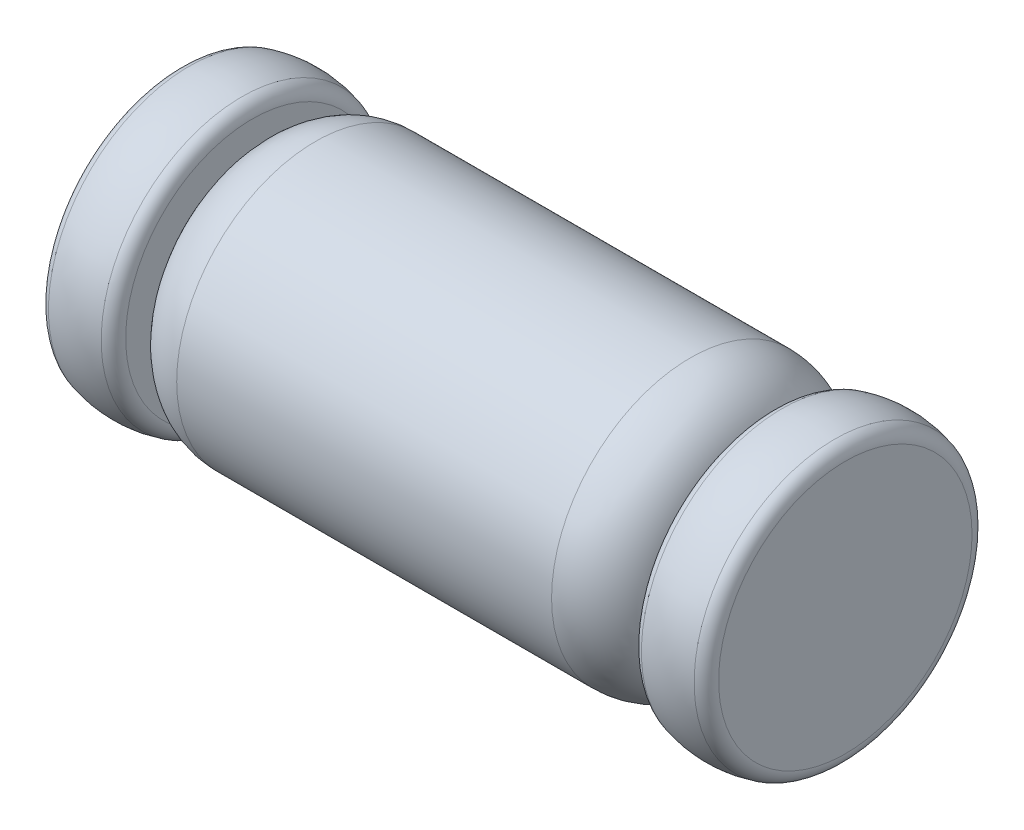
ISO-10303-21;
HEADER;
FILE_DESCRIPTION(('STEP AP214'),'2;1');
FILE_NAME('part.step','',(''),(''),'','','');
FILE_SCHEMA(('AUTOMOTIVE_DESIGN { 1 0 10303 214 1 1 1 1 }'));
ENDSEC;
DATA;
#1=APPLICATION_CONTEXT('core data for automotive mechanical design processes');
#2=APPLICATION_PROTOCOL_DEFINITION('international standard','automotive_design',2000,#1);
#3=PRODUCT_CONTEXT('',#1,'mechanical');
#4=PRODUCT('Part','Part','',(#3));
#5=PRODUCT_RELATED_PRODUCT_CATEGORY('part','',(#4));
#6=PRODUCT_DEFINITION_FORMATION('','',#4);
#7=PRODUCT_DEFINITION_CONTEXT('part definition',#1,'design');
#8=PRODUCT_DEFINITION('design','',#6,#7);
#9=PRODUCT_DEFINITION_SHAPE('','',#8);
#10=(LENGTH_UNIT() NAMED_UNIT(*) SI_UNIT(.MILLI.,.METRE.));
#11=(NAMED_UNIT(*) PLANE_ANGLE_UNIT() SI_UNIT($,.RADIAN.));
#12=(NAMED_UNIT(*) SI_UNIT($,.STERADIAN.) SOLID_ANGLE_UNIT());
#13=UNCERTAINTY_MEASURE_WITH_UNIT(LENGTH_MEASURE(1.E-05),#10,'distance_accuracy_value','');
#14=(GEOMETRIC_REPRESENTATION_CONTEXT(3) GLOBAL_UNCERTAINTY_ASSIGNED_CONTEXT((#13)) GLOBAL_UNIT_ASSIGNED_CONTEXT((#10,
#11,#12)) REPRESENTATION_CONTEXT('',''));
#15=CARTESIAN_POINT('',(0.,0.,0.));
#16=DIRECTION('',(0.,0.,1.));
#17=DIRECTION('',(1.,0.,0.));
#18=AXIS2_PLACEMENT_3D('',#15,#16,#17);
#19=CARTESIAN_POINT('',(2.79,0.,0.8));
#20=DIRECTION('',(-1.,0.,0.));
#21=DIRECTION('',(0.,0.,1.));
#22=AXIS2_PLACEMENT_3D('',#19,#20,#21);
#23=PLANE('',#22);
#24=CARTESIAN_POINT('',(2.79,0.,0.8));
#25=DIRECTION('',(1.,0.,0.));
#26=DIRECTION('',(0.,0.,-1.));
#27=AXIS2_PLACEMENT_3D('',#24,#25,#26);
#28=CIRCLE('',#27,0.375);
#29=CARTESIAN_POINT('',(2.79,0.,0.425));
#30=VERTEX_POINT('',#29);
#31=EDGE_CURVE('P0_E18',#30,#30,#28,.T.);
#32=ORIENTED_EDGE('',*,*,#31,.F.);
#33=EDGE_LOOP('',(#32));
#34=FACE_BOUND('',#33,.T.);
#35=ADVANCED_FACE('P0_F15',(#34),#23,.T.);
#36=CARTESIAN_POINT('',(2.79,0.,0.8));
#37=DIRECTION('',(1.,0.,0.));
#38=DIRECTION('',(0.,0.,-1.));
#39=AXIS2_PLACEMENT_3D('',#36,#37,#38);
#40=CYLINDRICAL_SURFACE('',#39,0.375);
#41=ORIENTED_EDGE('',*,*,#31,.T.);
#42=EDGE_LOOP('',(#41));
#43=FACE_BOUND('',#42,.T.);
#44=CARTESIAN_POINT('',(3.09,0.,0.8));
#45=DIRECTION('',(1.,0.,0.));
#46=DIRECTION('',(0.,0.,-1.));
#47=AXIS2_PLACEMENT_3D('',#44,#45,#46);
#48=CIRCLE('',#47,0.375);
#49=CARTESIAN_POINT('',(3.09,0.,0.425));
#50=VERTEX_POINT('',#49);
#51=EDGE_CURVE('P0_E88',#50,#50,#48,.T.);
#52=ORIENTED_EDGE('',*,*,#51,.F.);
#53=EDGE_LOOP('',(#52));
#54=FACE_BOUND('',#53,.T.);
#55=ADVANCED_FACE('P0_F100',(#43,#54),#40,.T.);
#56=CARTESIAN_POINT('',(3.09,0.,0.8));
#57=DIRECTION('',(-1.,0.,0.));
#58=DIRECTION('',(0.,0.,1.));
#59=AXIS2_PLACEMENT_3D('',#56,#57,#58);
#60=PLANE('',#59);
#61=ORIENTED_EDGE('',*,*,#51,.T.);
#62=EDGE_LOOP('',(#61));
#63=FACE_BOUND('',#62,.T.);
#64=CARTESIAN_POINT('',(3.09,0.,0.8));
#65=DIRECTION('',(1.,0.,0.));
#66=DIRECTION('',(0.,0.,-1.));
#67=AXIS2_PLACEMENT_3D('',#64,#65,#66);
#68=CIRCLE('',#67,0.70307284182568);
#69=CARTESIAN_POINT('',(3.09,0.,0.09692715817432));
#70=VERTEX_POINT('',#69);
#71=EDGE_CURVE('P0_E32',#70,#70,#68,.T.);
#72=ORIENTED_EDGE('',*,*,#71,.F.);
#73=EDGE_LOOP('',(#72));
#74=FACE_BOUND('',#73,.T.);
#75=ADVANCED_FACE('P0_F68',(#63,#74),#60,.T.);
#76=CARTESIAN_POINT('',(3.17,0.,0.8));
#77=DIRECTION('',(1.,0.,0.));
#78=DIRECTION('',(0.,0.,-1.));
#79=AXIS2_PLACEMENT_3D('',#76,#77,#78);
#80=TOROIDAL_SURFACE('',#79,0.703072841826,0.08);
#81=ORIENTED_EDGE('',*,*,#71,.T.);
#82=EDGE_LOOP('',(#81));
#83=FACE_BOUND('',#82,.T.);
#84=CARTESIAN_POINT('',(3.148723404255,0.,0.8));
#85=DIRECTION('',(-1.,0.,0.));
#86=DIRECTION('',(0.,0.,-1.));
#87=AXIS2_PLACEMENT_3D('',#84,#85,#86);
#88=CIRCLE('',#87,0.78019162341303);
#89=CARTESIAN_POINT('',(3.148723404255,0.,0.01980837658697));
#90=VERTEX_POINT('',#89);
#91=EDGE_CURVE('P0_E27',#90,#90,#88,.F.);
#92=ORIENTED_EDGE('',*,*,#91,.F.);
#93=EDGE_LOOP('',(#92));
#94=FACE_BOUND('',#93,.T.);
#95=ADVANCED_FACE('P0_F62',(#83,#94),#80,.T.);
#96=CARTESIAN_POINT('',(3.148723404255,0.,0.01980837658697));
#97=CARTESIAN_POINT('',(3.205813802928,0.,0.004057488042563));
#98=CARTESIAN_POINT('',(3.265024233891,0.,-0.004009539517617));
#99=CARTESIAN_POINT('',(3.324975766109,0.,-0.004009539517617));
#100=CARTESIAN_POINT('',(3.384186197072,0.,0.004057488042563));
#101=CARTESIAN_POINT('',(3.441276595745,0.,0.01980837658697));
#102=(BOUNDED_CURVE() B_SPLINE_CURVE(5,(#96,#97,#98,#99,#100,#101),.UNSPECIFIED.,.F.,
.F.) B_SPLINE_CURVE_WITH_KNOTS((6,6),(6.013988302966,6.552382311393),
.UNSPECIFIED.) CURVE() GEOMETRIC_REPRESENTATION_ITEM() RATIONAL_B_SPLINE_CURVE((1.,1.,1.,1.,1.,1.)) REPRESENTATION_ITEM(''));
#103=CARTESIAN_POINT('',(3.295,0.,0.8));
#104=DIRECTION('',(-1.,0.,0.));
#105=AXIS1_PLACEMENT('',#103,#104);
#106=SURFACE_OF_REVOLUTION('',#102,#105);
#107=ORIENTED_EDGE('',*,*,#91,.T.);
#108=EDGE_LOOP('',(#107));
#109=FACE_BOUND('',#108,.T.);
#110=CARTESIAN_POINT('',(3.44127659574506,0.,0.8));
#111=DIRECTION('',(1.,0.,0.));
#112=DIRECTION('',(0.,0.,-1.));
#113=AXIS2_PLACEMENT_3D('',#110,#111,#112);
#114=CIRCLE('',#113,0.780191623413246);
#115=CARTESIAN_POINT('',(3.44127659574506,0.,0.0198083765867545));
#116=VERTEX_POINT('',#115);
#117=EDGE_CURVE('P0_E22',#116,#116,#114,.T.);
#118=ORIENTED_EDGE('',*,*,#117,.F.);
#119=EDGE_LOOP('',(#118));
#120=FACE_BOUND('',#119,.T.);
#121=ADVANCED_FACE('P0_F58',(#109,#120),#106,.F.);
#122=CARTESIAN_POINT('',(3.42,0.,0.8));
#123=DIRECTION('',(1.,0.,0.));
#124=DIRECTION('',(0.,0.,-1.));
#125=AXIS2_PLACEMENT_3D('',#122,#123,#124);
#126=TOROIDAL_SURFACE('',#125,0.703072841826,0.08);
#127=ORIENTED_EDGE('',*,*,#117,.T.);
#128=EDGE_LOOP('',(#127));
#129=FACE_BOUND('',#128,.T.);
#130=CARTESIAN_POINT('',(3.5,0.,0.8));
#131=DIRECTION('',(-1.,0.,0.));
#132=DIRECTION('',(0.,0.,-1.));
#133=AXIS2_PLACEMENT_3D('',#130,#131,#132);
#134=CIRCLE('',#133,0.70307284182568);
#135=CARTESIAN_POINT('',(3.5,0.,0.09692715817432));
#136=VERTEX_POINT('',#135);
#137=EDGE_CURVE('P0_E10',#136,#136,#134,.F.);
#138=ORIENTED_EDGE('',*,*,#137,.F.);
#139=EDGE_LOOP('',(#138));
#140=FACE_BOUND('',#139,.T.);
#141=ADVANCED_FACE('P0_F47',(#129,#140),#126,.T.);
#142=CARTESIAN_POINT('',(3.5,0.,0.8));
#143=DIRECTION('',(1.,0.,0.));
#144=DIRECTION('',(0.,0.,-1.));
#145=AXIS2_PLACEMENT_3D('',#142,#143,#144);
#146=PLANE('',#145);
#147=ORIENTED_EDGE('',*,*,#137,.T.);
#148=EDGE_LOOP('',(#147));
#149=FACE_BOUND('',#148,.T.);
#150=ADVANCED_FACE('P0_F57',(#149),#146,.T.);
#151=CLOSED_SHELL('',(#35,#55,#75,#95,#121,#141,#150));
#152=MANIFOLD_SOLID_BREP('P0_B1',#151);
#153=CARTESIAN_POINT('',(2.99,0.,0.8));
#154=DIRECTION('',(1.,0.,0.));
#155=DIRECTION('',(0.,0.,-1.));
#156=AXIS2_PLACEMENT_3D('',#153,#154,#155);
#157=PLANE('',#156);
#158=CARTESIAN_POINT('',(2.99,0.,0.8));
#159=DIRECTION('',(-1.,0.,0.));
#160=DIRECTION('',(0.,0.,-1.));
#161=AXIS2_PLACEMENT_3D('',#158,#159,#160);
#162=CIRCLE('',#161,0.42);
#163=CARTESIAN_POINT('',(2.99,0.,0.38));
#164=VERTEX_POINT('',#163);
#165=EDGE_CURVE('P1_E57',#164,#164,#162,.T.);
#166=ORIENTED_EDGE('',*,*,#165,.F.);
#167=EDGE_LOOP('',(#166));
#168=FACE_BOUND('',#167,.T.);
#169=ADVANCED_FACE('P1_F15',(#168),#157,.T.);
#170=CARTESIAN_POINT('',(2.64,0.,0.8));
#171=DIRECTION('',(1.,0.,0.));
#172=DIRECTION('',(0.,0.,-1.));
#173=AXIS2_PLACEMENT_3D('',#170,#171,#172);
#174=TOROIDAL_SURFACE('',#173,0.42,0.35);
#175=CARTESIAN_POINT('',(2.64,0.,0.8));
#176=DIRECTION('',(1.,0.,0.));
#177=DIRECTION('',(0.,0.,-1.));
#178=AXIS2_PLACEMENT_3D('',#175,#176,#177);
#179=CIRCLE('',#178,0.77);
#180=CARTESIAN_POINT('',(2.64,0.,0.03));
#181=VERTEX_POINT('',#180);
#182=EDGE_CURVE('P1_E29',#181,#181,#179,.F.);
#183=ORIENTED_EDGE('',*,*,#182,.F.);
#184=EDGE_LOOP('',(#183));
#185=FACE_BOUND('',#184,.T.);
#186=ORIENTED_EDGE('',*,*,#165,.T.);
#187=EDGE_LOOP('',(#186));
#188=FACE_BOUND('',#187,.T.);
#189=ADVANCED_FACE('P1_F62',(#185,#188),#174,.T.);
#190=CARTESIAN_POINT('',(0.21,0.,0.8));
#191=DIRECTION('',(-1.,0.,0.));
#192=DIRECTION('',(0.,0.,1.));
#193=AXIS2_PLACEMENT_3D('',#190,#191,#192);
#194=PLANE('',#193);
#195=CARTESIAN_POINT('',(0.21,0.,0.8));
#196=DIRECTION('',(1.,0.,0.));
#197=DIRECTION('',(0.,0.,-1.));
#198=AXIS2_PLACEMENT_3D('',#195,#196,#197);
#199=CIRCLE('',#198,0.42);
#200=CARTESIAN_POINT('',(0.21,0.,0.38));
#201=VERTEX_POINT('',#200);
#202=EDGE_CURVE('P1_E24',#201,#201,#199,.T.);
#203=ORIENTED_EDGE('',*,*,#202,.F.);
#204=EDGE_LOOP('',(#203));
#205=FACE_BOUND('',#204,.T.);
#206=ADVANCED_FACE('P1_F42',(#205),#194,.T.);
#207=CARTESIAN_POINT('',(0.56,0.,0.8));
#208=DIRECTION('',(1.,0.,0.));
#209=DIRECTION('',(0.,0.,-1.));
#210=AXIS2_PLACEMENT_3D('',#207,#208,#209);
#211=TOROIDAL_SURFACE('',#210,0.42,0.35);
#212=ORIENTED_EDGE('',*,*,#202,.T.);
#213=EDGE_LOOP('',(#212));
#214=FACE_BOUND('',#213,.T.);
#215=CARTESIAN_POINT('',(0.56,0.,0.8));
#216=DIRECTION('',(1.,0.,0.));
#217=DIRECTION('',(0.,0.,-1.));
#218=AXIS2_PLACEMENT_3D('',#215,#216,#217);
#219=CIRCLE('',#218,0.77);
#220=CARTESIAN_POINT('',(0.56,0.,0.03));
#221=VERTEX_POINT('',#220);
#222=EDGE_CURVE('P1_E10',#221,#221,#219,.T.);
#223=ORIENTED_EDGE('',*,*,#222,.F.);
#224=EDGE_LOOP('',(#223));
#225=FACE_BOUND('',#224,.T.);
#226=ADVANCED_FACE('P1_F36',(#214,#225),#211,.T.);
#227=CARTESIAN_POINT('',(0.56,0.,0.8));
#228=DIRECTION('',(1.,0.,0.));
#229=DIRECTION('',(0.,0.,-1.));
#230=AXIS2_PLACEMENT_3D('',#227,#228,#229);
#231=CYLINDRICAL_SURFACE('',#230,0.77);
#232=ORIENTED_EDGE('',*,*,#222,.T.);
#233=EDGE_LOOP('',(#232));
#234=FACE_BOUND('',#233,.T.);
#235=ORIENTED_EDGE('',*,*,#182,.T.);
#236=EDGE_LOOP('',(#235));
#237=FACE_BOUND('',#236,.T.);
#238=ADVANCED_FACE('P1_F41',(#234,#237),#231,.T.);
#239=CLOSED_SHELL('',(#169,#189,#206,#226,#238));
#240=MANIFOLD_SOLID_BREP('P1_B1',#239);
#241=CARTESIAN_POINT('',(0.51,0.,0.8));
#242=DIRECTION('',(1.,0.,0.));
#243=DIRECTION('',(0.,0.,-1.));
#244=AXIS2_PLACEMENT_3D('',#241,#242,#243);
#245=PLANE('',#244);
#246=CARTESIAN_POINT('',(0.51,0.,0.8));
#247=DIRECTION('',(1.,0.,0.));
#248=DIRECTION('',(0.,0.,-1.));
#249=AXIS2_PLACEMENT_3D('',#246,#247,#248);
#250=CIRCLE('',#249,0.375);
#251=CARTESIAN_POINT('',(0.51,0.,0.425));
#252=VERTEX_POINT('',#251);
#253=EDGE_CURVE('P2_E18',#252,#252,#250,.F.);
#254=ORIENTED_EDGE('',*,*,#253,.F.);
#255=EDGE_LOOP('',(#254));
#256=FACE_BOUND('',#255,.T.);
#257=ADVANCED_FACE('P2_F15',(#256),#245,.T.);
#258=CARTESIAN_POINT('',(0.21,0.,0.8));
#259=DIRECTION('',(1.,0.,0.));
#260=DIRECTION('',(0.,0.,-1.));
#261=AXIS2_PLACEMENT_3D('',#258,#259,#260);
#262=CYLINDRICAL_SURFACE('',#261,0.375);
#263=CARTESIAN_POINT('',(0.21,0.,0.8));
#264=DIRECTION('',(1.,0.,0.));
#265=DIRECTION('',(0.,0.,-1.));
#266=AXIS2_PLACEMENT_3D('',#263,#264,#265);
#267=CIRCLE('',#266,0.375);
#268=CARTESIAN_POINT('',(0.21,0.,0.425));
#269=VERTEX_POINT('',#268);
#270=EDGE_CURVE('P2_E89',#269,#269,#267,.F.);
#271=ORIENTED_EDGE('',*,*,#270,.F.);
#272=EDGE_LOOP('',(#271));
#273=FACE_BOUND('',#272,.T.);
#274=ORIENTED_EDGE('',*,*,#253,.T.);
#275=EDGE_LOOP('',(#274));
#276=FACE_BOUND('',#275,.T.);
#277=ADVANCED_FACE('P2_F101',(#273,#276),#262,.T.);
#278=CARTESIAN_POINT('',(0.21,0.,0.8));
#279=DIRECTION('',(1.,0.,0.));
#280=DIRECTION('',(0.,0.,-1.));
#281=AXIS2_PLACEMENT_3D('',#278,#279,#280);
#282=PLANE('',#281);
#283=ORIENTED_EDGE('',*,*,#270,.T.);
#284=EDGE_LOOP('',(#283));
#285=FACE_BOUND('',#284,.T.);
#286=CARTESIAN_POINT('',(0.21,0.,0.8));
#287=DIRECTION('',(-1.,0.,0.));
#288=DIRECTION('',(0.,0.,-1.));
#289=AXIS2_PLACEMENT_3D('',#286,#287,#288);
#290=CIRCLE('',#289,0.70307284182568);
#291=CARTESIAN_POINT('',(0.21,0.,0.09692715817432));
#292=VERTEX_POINT('',#291);
#293=EDGE_CURVE('P2_E32',#292,#292,#290,.T.);
#294=ORIENTED_EDGE('',*,*,#293,.F.);
#295=EDGE_LOOP('',(#294));
#296=FACE_BOUND('',#295,.T.);
#297=ADVANCED_FACE('P2_F68',(#285,#296),#282,.T.);
#298=CARTESIAN_POINT('',(0.13,0.,0.8));
#299=DIRECTION('',(1.,0.,0.));
#300=DIRECTION('',(0.,0.,-1.));
#301=AXIS2_PLACEMENT_3D('',#298,#299,#300);
#302=TOROIDAL_SURFACE('',#301,0.703072841826,0.08);
#303=CARTESIAN_POINT('',(0.151276595745,0.,0.8));
#304=DIRECTION('',(-1.,0.,0.));
#305=DIRECTION('',(0.,0.,-1.));
#306=AXIS2_PLACEMENT_3D('',#303,#304,#305);
#307=CIRCLE('',#306,0.78019162341303);
#308=CARTESIAN_POINT('',(0.151276595745,0.,0.01980837658697));
#309=VERTEX_POINT('',#308);
#310=EDGE_CURVE('P2_E27',#309,#309,#307,.T.);
#311=ORIENTED_EDGE('',*,*,#310,.F.);
#312=EDGE_LOOP('',(#311));
#313=FACE_BOUND('',#312,.T.);
#314=ORIENTED_EDGE('',*,*,#293,.T.);
#315=EDGE_LOOP('',(#314));
#316=FACE_BOUND('',#315,.T.);
#317=ADVANCED_FACE('P2_F62',(#313,#316),#302,.T.);
#318=CARTESIAN_POINT('',(-0.141276595745,0.,0.01980837658697));
#319=CARTESIAN_POINT('',(-0.08418619707194,0.,0.004057488042563));
#320=CARTESIAN_POINT('',(-0.02497576610944,0.,-0.004009539517617));
#321=CARTESIAN_POINT('',(0.03497576610944,0.,-0.004009539517617));
#322=CARTESIAN_POINT('',(0.09418619707194,0.,0.004057488042563));
#323=CARTESIAN_POINT('',(0.151276595745,0.,0.01980837658697));
#324=(BOUNDED_CURVE() B_SPLINE_CURVE(5,(#318,#319,#320,#321,#322,#323),.UNSPECIFIED.,.F.,
.F.) B_SPLINE_CURVE_WITH_KNOTS((6,6),(6.013988302966,6.552382311393),
.UNSPECIFIED.) CURVE() GEOMETRIC_REPRESENTATION_ITEM() RATIONAL_B_SPLINE_CURVE((1.,1.,1.,1.,1.,1.)) REPRESENTATION_ITEM(''));
#325=CARTESIAN_POINT('',(0.005,0.,0.8));
#326=DIRECTION('',(-1.,0.,0.));
#327=AXIS1_PLACEMENT('',#325,#326);
#328=SURFACE_OF_REVOLUTION('',#324,#327);
#329=CARTESIAN_POINT('',(-0.14127659574506,0.,0.8));
#330=DIRECTION('',(1.,0.,0.));
#331=DIRECTION('',(0.,0.,-1.));
#332=AXIS2_PLACEMENT_3D('',#329,#330,#331);
#333=CIRCLE('',#332,0.780191623413246);
#334=CARTESIAN_POINT('',(-0.14127659574506,0.,0.0198083765867543));
#335=VERTEX_POINT('',#334);
#336=EDGE_CURVE('P2_E22',#335,#335,#333,.F.);
#337=ORIENTED_EDGE('',*,*,#336,.F.);
#338=EDGE_LOOP('',(#337));
#339=FACE_BOUND('',#338,.T.);
#340=ORIENTED_EDGE('',*,*,#310,.T.);
#341=EDGE_LOOP('',(#340));
#342=FACE_BOUND('',#341,.T.);
#343=ADVANCED_FACE('P2_F58',(#339,#342),#328,.F.);
#344=CARTESIAN_POINT('',(-0.12,0.,0.8));
#345=DIRECTION('',(1.,0.,0.));
#346=DIRECTION('',(0.,0.,-1.));
#347=AXIS2_PLACEMENT_3D('',#344,#345,#346);
#348=TOROIDAL_SURFACE('',#347,0.703072841826,0.08);
#349=CARTESIAN_POINT('',(-0.2,0.,0.8));
#350=DIRECTION('',(1.,0.,0.));
#351=DIRECTION('',(0.,0.,-1.));
#352=AXIS2_PLACEMENT_3D('',#349,#350,#351);
#353=CIRCLE('',#352,0.70307284182568);
#354=CARTESIAN_POINT('',(-0.2,0.,0.09692715817432));
#355=VERTEX_POINT('',#354);
#356=EDGE_CURVE('P2_E10',#355,#355,#353,.F.);
#357=ORIENTED_EDGE('',*,*,#356,.F.);
#358=EDGE_LOOP('',(#357));
#359=FACE_BOUND('',#358,.T.);
#360=ORIENTED_EDGE('',*,*,#336,.T.);
#361=EDGE_LOOP('',(#360));
#362=FACE_BOUND('',#361,.T.);
#363=ADVANCED_FACE('P2_F47',(#359,#362),#348,.T.);
#364=CARTESIAN_POINT('',(-0.2,0.,0.8));
#365=DIRECTION('',(-1.,0.,0.));
#366=DIRECTION('',(0.,0.,1.));
#367=AXIS2_PLACEMENT_3D('',#364,#365,#366);
#368=PLANE('',#367);
#369=ORIENTED_EDGE('',*,*,#356,.T.);
#370=EDGE_LOOP('',(#369));
#371=FACE_BOUND('',#370,.T.);
#372=ADVANCED_FACE('P2_F57',(#371),#368,.T.);
#373=CLOSED_SHELL('',(#257,#277,#297,#317,#343,#363,#372));
#374=MANIFOLD_SOLID_BREP('P2_B1',#373);
#375=ADVANCED_BREP_SHAPE_REPRESENTATION('',(#18,#152,#240,#374),#14);
#376=SHAPE_DEFINITION_REPRESENTATION(#9,#375);
ENDSEC;
END-ISO-10303-21;
